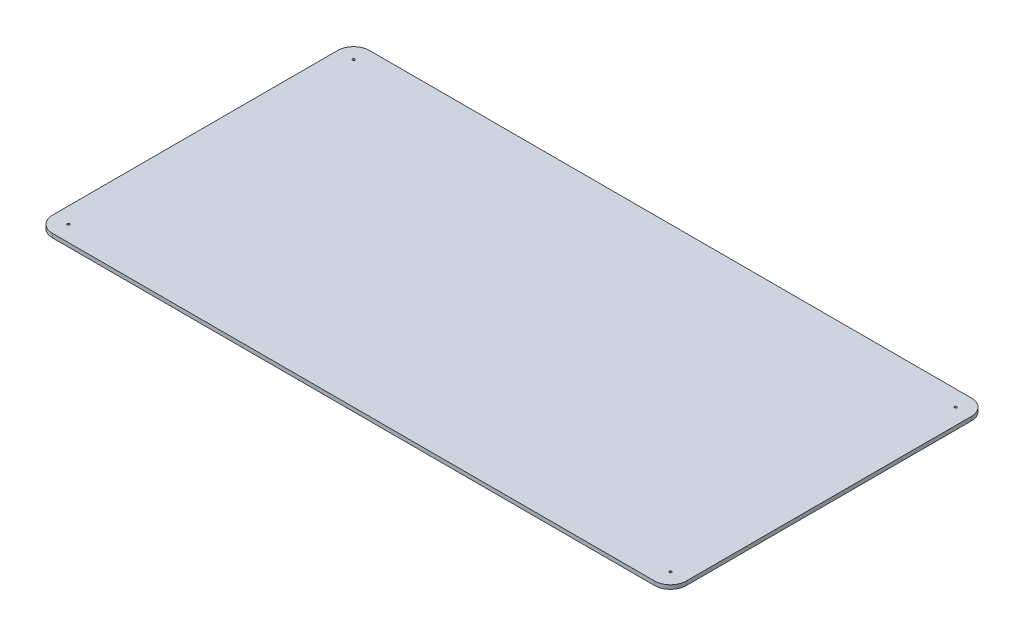
ISO-10303-21;
HEADER;
FILE_DESCRIPTION(('STEP AP214'),'2;1');
FILE_NAME('part.step','',(''),(''),'','','');
FILE_SCHEMA(('AUTOMOTIVE_DESIGN { 1 0 10303 214 1 1 1 1 }'));
ENDSEC;
DATA;
#1=APPLICATION_CONTEXT('core data for automotive mechanical design processes');
#2=APPLICATION_PROTOCOL_DEFINITION('international standard','automotive_design',2000,#1);
#3=PRODUCT_CONTEXT('',#1,'mechanical');
#4=PRODUCT('Part','Part','',(#3));
#5=PRODUCT_RELATED_PRODUCT_CATEGORY('part','',(#4));
#6=PRODUCT_DEFINITION_FORMATION('','',#4);
#7=PRODUCT_DEFINITION_CONTEXT('part definition',#1,'design');
#8=PRODUCT_DEFINITION('design','',#6,#7);
#9=PRODUCT_DEFINITION_SHAPE('','',#8);
#10=(LENGTH_UNIT() NAMED_UNIT(*) SI_UNIT(.MILLI.,.METRE.));
#11=(NAMED_UNIT(*) PLANE_ANGLE_UNIT() SI_UNIT($,.RADIAN.));
#12=(NAMED_UNIT(*) SI_UNIT($,.STERADIAN.) SOLID_ANGLE_UNIT());
#13=UNCERTAINTY_MEASURE_WITH_UNIT(LENGTH_MEASURE(1.E-05),#10,'distance_accuracy_value','');
#14=(GEOMETRIC_REPRESENTATION_CONTEXT(3) GLOBAL_UNCERTAINTY_ASSIGNED_CONTEXT((#13)) GLOBAL_UNIT_ASSIGNED_CONTEXT((#10,
#11,#12)) REPRESENTATION_CONTEXT('',''));
#15=CARTESIAN_POINT('',(0.,0.,0.));
#16=DIRECTION('',(0.,0.,1.));
#17=DIRECTION('',(1.,0.,0.));
#18=AXIS2_PLACEMENT_3D('',#15,#16,#17);
#19=CARTESIAN_POINT('',(0.,5.,0.));
#20=DIRECTION('',(1.,0.,0.));
#21=DIRECTION('',(0.,0.,-1.));
#22=AXIS2_PLACEMENT_3D('',#19,#20,#21);
#23=PLANE('',#22);
#24=DIRECTION('',(0.,0.,1.));
#25=VECTOR('',#24,1.);
#26=CARTESIAN_POINT('',(0.,0.,0.));
#27=LINE('',#26,#25);
#28=CARTESIAN_POINT('',(0.,0.,-380.));
#29=VERTEX_POINT('',#28);
#30=CARTESIAN_POINT('',(0.,0.,-20.));
#31=VERTEX_POINT('',#30);
#32=EDGE_CURVE('E157',#29,#31,#27,.T.);
#33=ORIENTED_EDGE('',*,*,#32,.T.);
#34=DIRECTION('',(0.,-1.,0.));
#35=VECTOR('',#34,1.);
#36=CARTESIAN_POINT('',(0.,5.,-20.));
#37=LINE('',#36,#35);
#38=CARTESIAN_POINT('',(0.,5.,-20.));
#39=VERTEX_POINT('',#38);
#40=EDGE_CURVE('E11',#31,#39,#37,.F.);
#41=ORIENTED_EDGE('',*,*,#40,.T.);
#42=DIRECTION('',(0.,0.,1.));
#43=VECTOR('',#42,1.);
#44=CARTESIAN_POINT('',(0.,5.,0.));
#45=LINE('',#44,#43);
#46=CARTESIAN_POINT('',(0.,5.,-380.));
#47=VERTEX_POINT('',#46);
#48=EDGE_CURVE('E125',#47,#39,#45,.T.);
#49=ORIENTED_EDGE('',*,*,#48,.F.);
#50=DIRECTION('',(0.,-1.,0.));
#51=VECTOR('',#50,1.);
#52=CARTESIAN_POINT('',(0.,5.,-380.));
#53=LINE('',#52,#51);
#54=EDGE_CURVE('E41',#47,#29,#53,.T.);
#55=ORIENTED_EDGE('',*,*,#54,.T.);
#56=EDGE_LOOP('',(#33,#41,#49,#55));
#57=FACE_BOUND('',#56,.T.);
#58=ADVANCED_FACE('F33',(#57),#23,.F.);
#59=CARTESIAN_POINT('',(0.,5.,0.));
#60=DIRECTION('',(0.,0.,-1.));
#61=DIRECTION('',(-1.,0.,0.));
#62=AXIS2_PLACEMENT_3D('',#59,#60,#61);
#63=PLANE('',#62);
#64=DIRECTION('',(1.,0.,0.));
#65=VECTOR('',#64,1.);
#66=CARTESIAN_POINT('',(0.,0.,0.));
#67=LINE('',#66,#65);
#68=CARTESIAN_POINT('',(20.,0.,0.));
#69=VERTEX_POINT('',#68);
#70=CARTESIAN_POINT('',(780.,0.,0.));
#71=VERTEX_POINT('',#70);
#72=EDGE_CURVE('E130',#69,#71,#67,.T.);
#73=ORIENTED_EDGE('',*,*,#72,.T.);
#74=DIRECTION('',(0.,-1.,0.));
#75=VECTOR('',#74,1.);
#76=CARTESIAN_POINT('',(780.,5.,0.));
#77=LINE('',#76,#75);
#78=CARTESIAN_POINT('',(780.,5.,0.));
#79=VERTEX_POINT('',#78);
#80=EDGE_CURVE('E48',#71,#79,#77,.F.);
#81=ORIENTED_EDGE('',*,*,#80,.T.);
#82=DIRECTION('',(1.,0.,0.));
#83=VECTOR('',#82,1.);
#84=CARTESIAN_POINT('',(0.,5.,0.));
#85=LINE('',#84,#83);
#86=CARTESIAN_POINT('',(20.,5.,0.));
#87=VERTEX_POINT('',#86);
#88=EDGE_CURVE('E128',#87,#79,#85,.T.);
#89=ORIENTED_EDGE('',*,*,#88,.F.);
#90=DIRECTION('',(0.,-1.,0.));
#91=VECTOR('',#90,1.);
#92=CARTESIAN_POINT('',(20.,5.,0.));
#93=LINE('',#92,#91);
#94=EDGE_CURVE('E149',#87,#69,#93,.T.);
#95=ORIENTED_EDGE('',*,*,#94,.T.);
#96=EDGE_LOOP('',(#73,#81,#89,#95));
#97=FACE_BOUND('',#96,.T.);
#98=ADVANCED_FACE('F217',(#97),#63,.F.);
#99=CARTESIAN_POINT('',(800.,5.,0.));
#100=DIRECTION('',(-1.,0.,0.));
#101=DIRECTION('',(0.,0.,1.));
#102=AXIS2_PLACEMENT_3D('',#99,#100,#101);
#103=PLANE('',#102);
#104=DIRECTION('',(0.,0.,-1.));
#105=VECTOR('',#104,1.);
#106=CARTESIAN_POINT('',(800.,0.,0.));
#107=LINE('',#106,#105);
#108=CARTESIAN_POINT('',(800.,0.,-20.));
#109=VERTEX_POINT('',#108);
#110=CARTESIAN_POINT('',(800.,0.,-380.));
#111=VERTEX_POINT('',#110);
#112=EDGE_CURVE('E126',#109,#111,#107,.T.);
#113=ORIENTED_EDGE('',*,*,#112,.T.);
#114=DIRECTION('',(0.,-1.,0.));
#115=VECTOR('',#114,1.);
#116=CARTESIAN_POINT('',(800.,5.,-380.));
#117=LINE('',#116,#115);
#118=CARTESIAN_POINT('',(800.,5.,-380.));
#119=VERTEX_POINT('',#118);
#120=EDGE_CURVE('E104',#111,#119,#117,.F.);
#121=ORIENTED_EDGE('',*,*,#120,.T.);
#122=DIRECTION('',(0.,0.,-1.));
#123=VECTOR('',#122,1.);
#124=CARTESIAN_POINT('',(800.,5.,0.));
#125=LINE('',#124,#123);
#126=CARTESIAN_POINT('',(800.,5.,-20.));
#127=VERTEX_POINT('',#126);
#128=EDGE_CURVE('E169',#127,#119,#125,.T.);
#129=ORIENTED_EDGE('',*,*,#128,.F.);
#130=DIRECTION('',(0.,-1.,0.));
#131=VECTOR('',#130,1.);
#132=CARTESIAN_POINT('',(800.,5.,-20.));
#133=LINE('',#132,#131);
#134=EDGE_CURVE('E109',#127,#109,#133,.T.);
#135=ORIENTED_EDGE('',*,*,#134,.T.);
#136=EDGE_LOOP('',(#113,#121,#129,#135));
#137=FACE_BOUND('',#136,.T.);
#138=ADVANCED_FACE('F214',(#137),#103,.F.);
#139=CARTESIAN_POINT('',(0.,5.,-400.));
#140=DIRECTION('',(0.,0.,1.));
#141=DIRECTION('',(1.,0.,0.));
#142=AXIS2_PLACEMENT_3D('',#139,#140,#141);
#143=PLANE('',#142);
#144=DIRECTION('',(-1.,0.,0.));
#145=VECTOR('',#144,1.);
#146=CARTESIAN_POINT('',(0.,5.,-400.));
#147=LINE('',#146,#145);
#148=CARTESIAN_POINT('',(780.,5.,-400.));
#149=VERTEX_POINT('',#148);
#150=CARTESIAN_POINT('',(20.,5.,-400.));
#151=VERTEX_POINT('',#150);
#152=EDGE_CURVE('E119',#149,#151,#147,.T.);
#153=ORIENTED_EDGE('',*,*,#152,.F.);
#154=DIRECTION('',(0.,-1.,0.));
#155=VECTOR('',#154,1.);
#156=CARTESIAN_POINT('',(780.,5.,-400.));
#157=LINE('',#156,#155);
#158=CARTESIAN_POINT('',(780.,0.,-400.));
#159=VERTEX_POINT('',#158);
#160=EDGE_CURVE('E103',#149,#159,#157,.T.);
#161=ORIENTED_EDGE('',*,*,#160,.T.);
#162=DIRECTION('',(-1.,0.,0.));
#163=VECTOR('',#162,1.);
#164=CARTESIAN_POINT('',(0.,0.,-400.));
#165=LINE('',#164,#163);
#166=CARTESIAN_POINT('',(20.,0.,-400.));
#167=VERTEX_POINT('',#166);
#168=EDGE_CURVE('E116',#159,#167,#165,.T.);
#169=ORIENTED_EDGE('',*,*,#168,.T.);
#170=DIRECTION('',(0.,-1.,0.));
#171=VECTOR('',#170,1.);
#172=CARTESIAN_POINT('',(20.,5.,-400.));
#173=LINE('',#172,#171);
#174=EDGE_CURVE('E121',#167,#151,#173,.F.);
#175=ORIENTED_EDGE('',*,*,#174,.T.);
#176=EDGE_LOOP('',(#153,#161,#169,#175));
#177=FACE_BOUND('',#176,.T.);
#178=ADVANCED_FACE('F115',(#177),#143,.F.);
#179=CARTESIAN_POINT('',(0.,5.,0.));
#180=DIRECTION('',(0.,-1.,0.));
#181=DIRECTION('',(0.,0.,-1.));
#182=AXIS2_PLACEMENT_3D('',#179,#180,#181);
#183=PLANE('',#182);
#184=CARTESIAN_POINT('',(19.9999999999999,5.,-20.0000000000001));
#185=DIRECTION('',(0.,1.,0.));
#186=DIRECTION('',(0.,0.,-1.));
#187=AXIS2_PLACEMENT_3D('',#184,#185,#186);
#188=CIRCLE('',#187,1.5);
#189=CARTESIAN_POINT('',(19.9999999999999,5.,-21.5000000000001));
#190=VERTEX_POINT('',#189);
#191=EDGE_CURVE('E176',#190,#190,#188,.T.);
#192=ORIENTED_EDGE('',*,*,#191,.F.);
#193=EDGE_LOOP('',(#192));
#194=FACE_BOUND('',#193,.T.);
#195=CARTESIAN_POINT('',(780.,5.,-19.9999999999999));
#196=DIRECTION('',(0.,1.,0.));
#197=DIRECTION('',(0.,0.,1.));
#198=AXIS2_PLACEMENT_3D('',#195,#196,#197);
#199=CIRCLE('',#198,1.49999999999997);
#200=CARTESIAN_POINT('',(780.,5.,-18.4999999999999));
#201=VERTEX_POINT('',#200);
#202=EDGE_CURVE('E182',#201,#201,#199,.T.);
#203=ORIENTED_EDGE('',*,*,#202,.F.);
#204=EDGE_LOOP('',(#203));
#205=FACE_BOUND('',#204,.T.);
#206=CARTESIAN_POINT('',(780.,5.,-380.));
#207=DIRECTION('',(0.,1.,0.));
#208=DIRECTION('',(0.,0.,-1.));
#209=AXIS2_PLACEMENT_3D('',#206,#207,#208);
#210=CIRCLE('',#209,1.49999999999997);
#211=CARTESIAN_POINT('',(780.,5.,-381.5));
#212=VERTEX_POINT('',#211);
#213=EDGE_CURVE('E188',#212,#212,#210,.T.);
#214=ORIENTED_EDGE('',*,*,#213,.F.);
#215=EDGE_LOOP('',(#214));
#216=FACE_BOUND('',#215,.T.);
#217=CARTESIAN_POINT('',(20.,5.,-380.));
#218=DIRECTION('',(0.,1.,0.));
#219=DIRECTION('',(0.,0.,1.));
#220=AXIS2_PLACEMENT_3D('',#217,#218,#219);
#221=CIRCLE('',#220,1.5);
#222=CARTESIAN_POINT('',(20.,5.,-378.5));
#223=VERTEX_POINT('',#222);
#224=EDGE_CURVE('E165',#223,#223,#221,.T.);
#225=ORIENTED_EDGE('',*,*,#224,.F.);
#226=EDGE_LOOP('',(#225));
#227=FACE_BOUND('',#226,.T.);
#228=ORIENTED_EDGE('',*,*,#128,.T.);
#229=CARTESIAN_POINT('',(780.,5.,-380.));
#230=DIRECTION('',(0.,-1.,0.));
#231=DIRECTION('',(0.,0.,-1.));
#232=AXIS2_PLACEMENT_3D('',#229,#230,#231);
#233=CIRCLE('',#232,20.);
#234=EDGE_CURVE('E147',#119,#149,#233,.F.);
#235=ORIENTED_EDGE('',*,*,#234,.T.);
#236=ORIENTED_EDGE('',*,*,#152,.T.);
#237=CARTESIAN_POINT('',(20.,5.,-380.));
#238=DIRECTION('',(0.,-1.,0.));
#239=DIRECTION('',(0.,0.,-1.));
#240=AXIS2_PLACEMENT_3D('',#237,#238,#239);
#241=CIRCLE('',#240,20.);
#242=EDGE_CURVE('E142',#151,#47,#241,.F.);
#243=ORIENTED_EDGE('',*,*,#242,.T.);
#244=ORIENTED_EDGE('',*,*,#48,.T.);
#245=CARTESIAN_POINT('',(20.,5.,-20.));
#246=DIRECTION('',(0.,-1.,0.));
#247=DIRECTION('',(0.,0.,-1.));
#248=AXIS2_PLACEMENT_3D('',#245,#246,#247);
#249=CIRCLE('',#248,20.);
#250=EDGE_CURVE('E55',#39,#87,#249,.F.);
#251=ORIENTED_EDGE('',*,*,#250,.T.);
#252=ORIENTED_EDGE('',*,*,#88,.T.);
#253=CARTESIAN_POINT('',(780.,5.,-20.));
#254=DIRECTION('',(0.,-1.,0.));
#255=DIRECTION('',(0.,0.,-1.));
#256=AXIS2_PLACEMENT_3D('',#253,#254,#255);
#257=CIRCLE('',#256,20.);
#258=EDGE_CURVE('E145',#79,#127,#257,.F.);
#259=ORIENTED_EDGE('',*,*,#258,.T.);
#260=EDGE_LOOP('',(#228,#235,#236,#243,#244,#251,#252,#259));
#261=FACE_BOUND('',#260,.T.);
#262=ADVANCED_FACE('F204',(#194,#205,#216,#227,#261),#183,.F.);
#263=CARTESIAN_POINT('',(0.,0.,0.));
#264=DIRECTION('',(0.,-1.,0.));
#265=DIRECTION('',(0.,0.,-1.));
#266=AXIS2_PLACEMENT_3D('',#263,#264,#265);
#267=PLANE('',#266);
#268=CARTESIAN_POINT('',(19.9999999999999,0.,-20.0000000000001));
#269=DIRECTION('',(0.,1.,0.));
#270=DIRECTION('',(0.,0.,-1.));
#271=AXIS2_PLACEMENT_3D('',#268,#269,#270);
#272=CIRCLE('',#271,1.5);
#273=CARTESIAN_POINT('',(19.9999999999999,0.,-21.5000000000001));
#274=VERTEX_POINT('',#273);
#275=EDGE_CURVE('E179',#274,#274,#272,.T.);
#276=ORIENTED_EDGE('',*,*,#275,.T.);
#277=EDGE_LOOP('',(#276));
#278=FACE_BOUND('',#277,.T.);
#279=CARTESIAN_POINT('',(780.,0.,-19.9999999999999));
#280=DIRECTION('',(0.,1.,0.));
#281=DIRECTION('',(0.,0.,1.));
#282=AXIS2_PLACEMENT_3D('',#279,#280,#281);
#283=CIRCLE('',#282,1.49999999999997);
#284=CARTESIAN_POINT('',(780.,0.,-18.4999999999999));
#285=VERTEX_POINT('',#284);
#286=EDGE_CURVE('E185',#285,#285,#283,.T.);
#287=ORIENTED_EDGE('',*,*,#286,.T.);
#288=EDGE_LOOP('',(#287));
#289=FACE_BOUND('',#288,.T.);
#290=CARTESIAN_POINT('',(780.,0.,-380.));
#291=DIRECTION('',(0.,1.,0.));
#292=DIRECTION('',(0.,0.,-1.));
#293=AXIS2_PLACEMENT_3D('',#290,#291,#292);
#294=CIRCLE('',#293,1.49999999999997);
#295=CARTESIAN_POINT('',(780.,0.,-381.5));
#296=VERTEX_POINT('',#295);
#297=EDGE_CURVE('E174',#296,#296,#294,.T.);
#298=ORIENTED_EDGE('',*,*,#297,.T.);
#299=EDGE_LOOP('',(#298));
#300=FACE_BOUND('',#299,.T.);
#301=CARTESIAN_POINT('',(20.,0.,-380.));
#302=DIRECTION('',(0.,1.,0.));
#303=DIRECTION('',(0.,0.,1.));
#304=AXIS2_PLACEMENT_3D('',#301,#302,#303);
#305=CIRCLE('',#304,1.5);
#306=CARTESIAN_POINT('',(20.,0.,-378.5));
#307=VERTEX_POINT('',#306);
#308=EDGE_CURVE('E162',#307,#307,#305,.T.);
#309=ORIENTED_EDGE('',*,*,#308,.T.);
#310=EDGE_LOOP('',(#309));
#311=FACE_BOUND('',#310,.T.);
#312=ORIENTED_EDGE('',*,*,#168,.F.);
#313=CARTESIAN_POINT('',(780.,0.,-380.));
#314=DIRECTION('',(0.,-1.,0.));
#315=DIRECTION('',(0.,0.,-1.));
#316=AXIS2_PLACEMENT_3D('',#313,#314,#315);
#317=CIRCLE('',#316,20.);
#318=EDGE_CURVE('E99',#159,#111,#317,.T.);
#319=ORIENTED_EDGE('',*,*,#318,.T.);
#320=ORIENTED_EDGE('',*,*,#112,.F.);
#321=CARTESIAN_POINT('',(780.,0.,-20.));
#322=DIRECTION('',(0.,-1.,0.));
#323=DIRECTION('',(0.,0.,-1.));
#324=AXIS2_PLACEMENT_3D('',#321,#322,#323);
#325=CIRCLE('',#324,20.);
#326=EDGE_CURVE('E110',#109,#71,#325,.T.);
#327=ORIENTED_EDGE('',*,*,#326,.T.);
#328=ORIENTED_EDGE('',*,*,#72,.F.);
#329=CARTESIAN_POINT('',(20.,0.,-20.));
#330=DIRECTION('',(0.,-1.,0.));
#331=DIRECTION('',(0.,0.,-1.));
#332=AXIS2_PLACEMENT_3D('',#329,#330,#331);
#333=CIRCLE('',#332,20.);
#334=EDGE_CURVE('E136',#69,#31,#333,.T.);
#335=ORIENTED_EDGE('',*,*,#334,.T.);
#336=ORIENTED_EDGE('',*,*,#32,.F.);
#337=CARTESIAN_POINT('',(20.,0.,-380.));
#338=DIRECTION('',(0.,-1.,0.));
#339=DIRECTION('',(0.,0.,-1.));
#340=AXIS2_PLACEMENT_3D('',#337,#338,#339);
#341=CIRCLE('',#340,20.);
#342=EDGE_CURVE('E120',#29,#167,#341,.T.);
#343=ORIENTED_EDGE('',*,*,#342,.T.);
#344=EDGE_LOOP('',(#312,#319,#320,#327,#328,#335,#336,#343));
#345=FACE_BOUND('',#344,.T.);
#346=ADVANCED_FACE('F123',(#278,#289,#300,#311,#345),#267,.T.);
#347=CARTESIAN_POINT('',(780.,5.,-380.));
#348=DIRECTION('',(0.,-1.,0.));
#349=DIRECTION('',(0.,0.,-1.));
#350=AXIS2_PLACEMENT_3D('',#347,#348,#349);
#351=CYLINDRICAL_SURFACE('',#350,20.);
#352=ORIENTED_EDGE('',*,*,#234,.F.);
#353=ORIENTED_EDGE('',*,*,#120,.F.);
#354=ORIENTED_EDGE('',*,*,#318,.F.);
#355=ORIENTED_EDGE('',*,*,#160,.F.);
#356=EDGE_LOOP('',(#352,#353,#354,#355));
#357=FACE_BOUND('',#356,.T.);
#358=ADVANCED_FACE('F102',(#357),#351,.T.);
#359=CARTESIAN_POINT('',(780.,5.,-20.));
#360=DIRECTION('',(0.,-1.,0.));
#361=DIRECTION('',(0.,0.,-1.));
#362=AXIS2_PLACEMENT_3D('',#359,#360,#361);
#363=CYLINDRICAL_SURFACE('',#362,20.);
#364=ORIENTED_EDGE('',*,*,#258,.F.);
#365=ORIENTED_EDGE('',*,*,#80,.F.);
#366=ORIENTED_EDGE('',*,*,#326,.F.);
#367=ORIENTED_EDGE('',*,*,#134,.F.);
#368=EDGE_LOOP('',(#364,#365,#366,#367));
#369=FACE_BOUND('',#368,.T.);
#370=ADVANCED_FACE('F216',(#369),#363,.T.);
#371=CARTESIAN_POINT('',(20.,5.,-20.));
#372=DIRECTION('',(0.,-1.,0.));
#373=DIRECTION('',(0.,0.,-1.));
#374=AXIS2_PLACEMENT_3D('',#371,#372,#373);
#375=CYLINDRICAL_SURFACE('',#374,20.);
#376=ORIENTED_EDGE('',*,*,#250,.F.);
#377=ORIENTED_EDGE('',*,*,#40,.F.);
#378=ORIENTED_EDGE('',*,*,#334,.F.);
#379=ORIENTED_EDGE('',*,*,#94,.F.);
#380=EDGE_LOOP('',(#376,#377,#378,#379));
#381=FACE_BOUND('',#380,.T.);
#382=ADVANCED_FACE('F220',(#381),#375,.T.);
#383=CARTESIAN_POINT('',(20.,5.,-380.));
#384=DIRECTION('',(0.,-1.,0.));
#385=DIRECTION('',(0.,0.,-1.));
#386=AXIS2_PLACEMENT_3D('',#383,#384,#385);
#387=CYLINDRICAL_SURFACE('',#386,20.);
#388=ORIENTED_EDGE('',*,*,#242,.F.);
#389=ORIENTED_EDGE('',*,*,#174,.F.);
#390=ORIENTED_EDGE('',*,*,#342,.F.);
#391=ORIENTED_EDGE('',*,*,#54,.F.);
#392=EDGE_LOOP('',(#388,#389,#390,#391));
#393=FACE_BOUND('',#392,.T.);
#394=ADVANCED_FACE('F35',(#393),#387,.T.);
#395=CARTESIAN_POINT('',(20.,0.,-380.));
#396=DIRECTION('',(0.,1.,0.));
#397=DIRECTION('',(0.,0.,1.));
#398=AXIS2_PLACEMENT_3D('',#395,#396,#397);
#399=CYLINDRICAL_SURFACE('',#398,1.5);
#400=ORIENTED_EDGE('',*,*,#308,.F.);
#401=EDGE_LOOP('',(#400));
#402=FACE_BOUND('',#401,.T.);
#403=ORIENTED_EDGE('',*,*,#224,.T.);
#404=EDGE_LOOP('',(#403));
#405=FACE_BOUND('',#404,.T.);
#406=ADVANCED_FACE('F200',(#402,#405),#399,.F.);
#407=CARTESIAN_POINT('',(780.,0.,-380.));
#408=DIRECTION('',(0.,1.,0.));
#409=DIRECTION('',(0.,0.,1.));
#410=AXIS2_PLACEMENT_3D('',#407,#408,#409);
#411=CYLINDRICAL_SURFACE('',#410,1.49999999999997);
#412=ORIENTED_EDGE('',*,*,#297,.F.);
#413=EDGE_LOOP('',(#412));
#414=FACE_BOUND('',#413,.T.);
#415=ORIENTED_EDGE('',*,*,#213,.T.);
#416=EDGE_LOOP('',(#415));
#417=FACE_BOUND('',#416,.T.);
#418=ADVANCED_FACE('F196',(#414,#417),#411,.F.);
#419=CARTESIAN_POINT('',(780.,0.,-19.9999999999999));
#420=DIRECTION('',(0.,1.,0.));
#421=DIRECTION('',(0.,0.,1.));
#422=AXIS2_PLACEMENT_3D('',#419,#420,#421);
#423=CYLINDRICAL_SURFACE('',#422,1.49999999999997);
#424=ORIENTED_EDGE('',*,*,#286,.F.);
#425=EDGE_LOOP('',(#424));
#426=FACE_BOUND('',#425,.T.);
#427=ORIENTED_EDGE('',*,*,#202,.T.);
#428=EDGE_LOOP('',(#427));
#429=FACE_BOUND('',#428,.T.);
#430=ADVANCED_FACE('F199',(#426,#429),#423,.F.);
#431=CARTESIAN_POINT('',(19.9999999999999,0.,-20.0000000000001));
#432=DIRECTION('',(0.,1.,0.));
#433=DIRECTION('',(0.,0.,1.));
#434=AXIS2_PLACEMENT_3D('',#431,#432,#433);
#435=CYLINDRICAL_SURFACE('',#434,1.5);
#436=ORIENTED_EDGE('',*,*,#275,.F.);
#437=EDGE_LOOP('',(#436));
#438=FACE_BOUND('',#437,.T.);
#439=ORIENTED_EDGE('',*,*,#191,.T.);
#440=EDGE_LOOP('',(#439));
#441=FACE_BOUND('',#440,.T.);
#442=ADVANCED_FACE('F290',(#438,#441),#435,.F.);
#443=CLOSED_SHELL('',(#58,#98,#138,#178,#262,#346,#358,#370,#382,#394,#406,#418,#430,#442));
#444=MANIFOLD_SOLID_BREP('B2',#443);
#445=ADVANCED_BREP_SHAPE_REPRESENTATION('',(#18,#444),#14);
#446=SHAPE_DEFINITION_REPRESENTATION(#9,#445);
ENDSEC;
END-ISO-10303-21;
